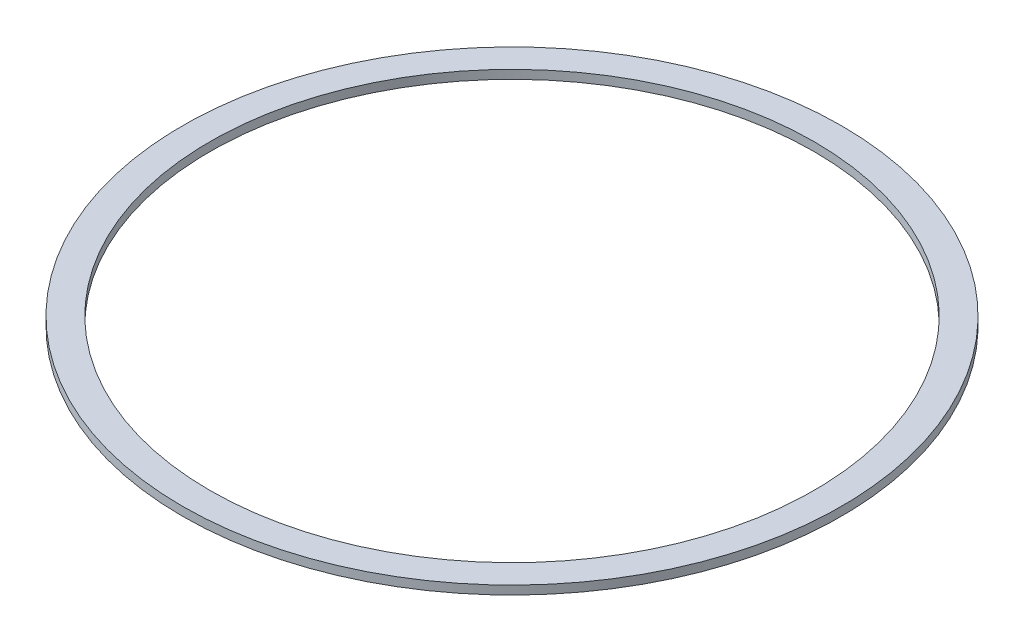
ISO-10303-21;
HEADER;
FILE_DESCRIPTION(('STEP AP214'),'2;1');
FILE_NAME('part.step','',(''),(''),'','','');
FILE_SCHEMA(('AUTOMOTIVE_DESIGN { 1 0 10303 214 1 1 1 1 }'));
ENDSEC;
DATA;
#1=APPLICATION_CONTEXT('core data for automotive mechanical design processes');
#2=APPLICATION_PROTOCOL_DEFINITION('international standard','automotive_design',2000,#1);
#3=PRODUCT_CONTEXT('',#1,'mechanical');
#4=PRODUCT('Part','Part','',(#3));
#5=PRODUCT_RELATED_PRODUCT_CATEGORY('part','',(#4));
#6=PRODUCT_DEFINITION_FORMATION('','',#4);
#7=PRODUCT_DEFINITION_CONTEXT('part definition',#1,'design');
#8=PRODUCT_DEFINITION('design','',#6,#7);
#9=PRODUCT_DEFINITION_SHAPE('','',#8);
#10=(LENGTH_UNIT() NAMED_UNIT(*) SI_UNIT(.MILLI.,.METRE.));
#11=(NAMED_UNIT(*) PLANE_ANGLE_UNIT() SI_UNIT($,.RADIAN.));
#12=(NAMED_UNIT(*) SI_UNIT($,.STERADIAN.) SOLID_ANGLE_UNIT());
#13=UNCERTAINTY_MEASURE_WITH_UNIT(LENGTH_MEASURE(1.E-05),#10,'distance_accuracy_value','');
#14=(GEOMETRIC_REPRESENTATION_CONTEXT(3) GLOBAL_UNCERTAINTY_ASSIGNED_CONTEXT((#13)) GLOBAL_UNIT_ASSIGNED_CONTEXT((#10,
#11,#12)) REPRESENTATION_CONTEXT('',''));
#15=CARTESIAN_POINT('',(0.,0.,0.));
#16=DIRECTION('',(0.,0.,1.));
#17=DIRECTION('',(1.,0.,0.));
#18=AXIS2_PLACEMENT_3D('',#15,#16,#17);
#19=CARTESIAN_POINT('',(0.,2.,0.));
#20=DIRECTION('',(0.,1.,0.));
#21=DIRECTION('',(0.,0.,1.));
#22=AXIS2_PLACEMENT_3D('',#19,#20,#21);
#23=PLANE('',#22);
#24=CARTESIAN_POINT('',(0.,2.,0.));
#25=DIRECTION('',(0.,1.,0.));
#26=DIRECTION('',(0.,0.,1.));
#27=AXIS2_PLACEMENT_3D('',#24,#25,#26);
#28=CIRCLE('',#27,76.2);
#29=CARTESIAN_POINT('',(0.,2.,76.2));
#30=VERTEX_POINT('',#29);
#31=EDGE_CURVE('E10',#30,#30,#28,.T.);
#32=ORIENTED_EDGE('',*,*,#31,.T.);
#33=EDGE_LOOP('',(#32));
#34=FACE_BOUND('',#33,.T.);
#35=CARTESIAN_POINT('',(0.,2.,0.));
#36=DIRECTION('',(0.,1.,0.));
#37=DIRECTION('',(0.,0.,1.));
#38=AXIS2_PLACEMENT_3D('',#35,#36,#37);
#39=CIRCLE('',#38,69.85);
#40=CARTESIAN_POINT('',(0.,2.,69.85));
#41=VERTEX_POINT('',#40);
#42=EDGE_CURVE('E50',#41,#41,#39,.T.);
#43=ORIENTED_EDGE('',*,*,#42,.F.);
#44=EDGE_LOOP('',(#43));
#45=FACE_BOUND('',#44,.T.);
#46=ADVANCED_FACE('F39',(#34,#45),#23,.T.);
#47=CARTESIAN_POINT('',(0.,0.,0.));
#48=DIRECTION('',(0.,1.,0.));
#49=DIRECTION('',(0.,0.,1.));
#50=AXIS2_PLACEMENT_3D('',#47,#48,#49);
#51=PLANE('',#50);
#52=CARTESIAN_POINT('',(0.,0.,0.));
#53=DIRECTION('',(0.,1.,0.));
#54=DIRECTION('',(0.,0.,1.));
#55=AXIS2_PLACEMENT_3D('',#52,#53,#54);
#56=CIRCLE('',#55,76.2);
#57=CARTESIAN_POINT('',(0.,0.,76.2));
#58=VERTEX_POINT('',#57);
#59=EDGE_CURVE('E43',#58,#58,#56,.T.);
#60=ORIENTED_EDGE('',*,*,#59,.F.);
#61=EDGE_LOOP('',(#60));
#62=FACE_BOUND('',#61,.T.);
#63=CARTESIAN_POINT('',(0.,0.,0.));
#64=DIRECTION('',(0.,1.,0.));
#65=DIRECTION('',(0.,0.,1.));
#66=AXIS2_PLACEMENT_3D('',#63,#64,#65);
#67=CIRCLE('',#66,69.85);
#68=CARTESIAN_POINT('',(0.,0.,69.85));
#69=VERTEX_POINT('',#68);
#70=EDGE_CURVE('E52',#69,#69,#67,.T.);
#71=ORIENTED_EDGE('',*,*,#70,.T.);
#72=EDGE_LOOP('',(#71));
#73=FACE_BOUND('',#72,.T.);
#74=ADVANCED_FACE('F62',(#62,#73),#51,.F.);
#75=CARTESIAN_POINT('',(0.,2.,0.));
#76=DIRECTION('',(0.,-1.,0.));
#77=DIRECTION('',(0.,0.,-1.));
#78=AXIS2_PLACEMENT_3D('',#75,#76,#77);
#79=CYLINDRICAL_SURFACE('',#78,76.2);
#80=ORIENTED_EDGE('',*,*,#31,.F.);
#81=EDGE_LOOP('',(#80));
#82=FACE_BOUND('',#81,.T.);
#83=ORIENTED_EDGE('',*,*,#59,.T.);
#84=EDGE_LOOP('',(#83));
#85=FACE_BOUND('',#84,.T.);
#86=ADVANCED_FACE('F41',(#82,#85),#79,.T.);
#87=CARTESIAN_POINT('',(0.,2.,0.));
#88=DIRECTION('',(0.,-1.,0.));
#89=DIRECTION('',(0.,0.,-1.));
#90=AXIS2_PLACEMENT_3D('',#87,#88,#89);
#91=CYLINDRICAL_SURFACE('',#90,69.85);
#92=ORIENTED_EDGE('',*,*,#42,.T.);
#93=EDGE_LOOP('',(#92));
#94=FACE_BOUND('',#93,.T.);
#95=ORIENTED_EDGE('',*,*,#70,.F.);
#96=EDGE_LOOP('',(#95));
#97=FACE_BOUND('',#96,.T.);
#98=ADVANCED_FACE('F58',(#94,#97),#91,.F.);
#99=CLOSED_SHELL('',(#46,#74,#86,#98));
#100=MANIFOLD_SOLID_BREP('B2',#99);
#101=ADVANCED_BREP_SHAPE_REPRESENTATION('',(#18,#100),#14);
#102=SHAPE_DEFINITION_REPRESENTATION(#9,#101);
ENDSEC;
END-ISO-10303-21;
